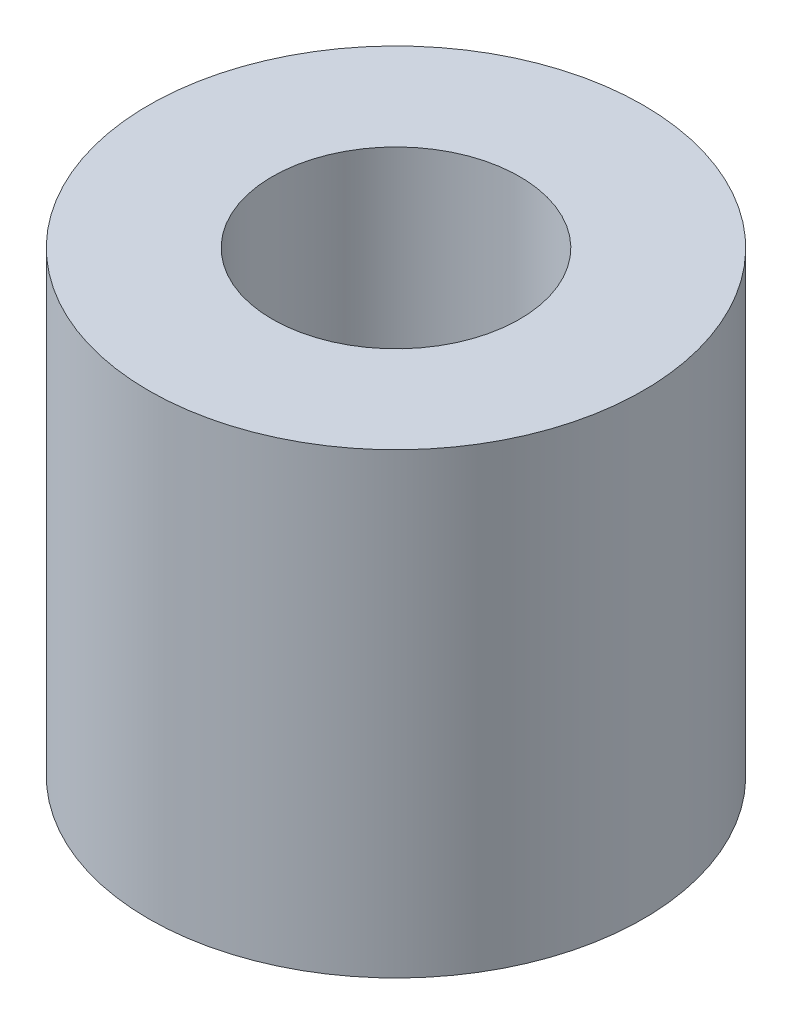
ISO-10303-21;
HEADER;
FILE_DESCRIPTION(('STEP AP214'),'2;1');
FILE_NAME('part.step','',(''),(''),'','','');
FILE_SCHEMA(('AUTOMOTIVE_DESIGN { 1 0 10303 214 1 1 1 1 }'));
ENDSEC;
DATA;
#1=APPLICATION_CONTEXT('core data for automotive mechanical design processes');
#2=APPLICATION_PROTOCOL_DEFINITION('international standard','automotive_design',2000,#1);
#3=PRODUCT_CONTEXT('',#1,'mechanical');
#4=PRODUCT('Part','Part','',(#3));
#5=PRODUCT_RELATED_PRODUCT_CATEGORY('part','',(#4));
#6=PRODUCT_DEFINITION_FORMATION('','',#4);
#7=PRODUCT_DEFINITION_CONTEXT('part definition',#1,'design');
#8=PRODUCT_DEFINITION('design','',#6,#7);
#9=PRODUCT_DEFINITION_SHAPE('','',#8);
#10=(LENGTH_UNIT() NAMED_UNIT(*) SI_UNIT(.MILLI.,.METRE.));
#11=(NAMED_UNIT(*) PLANE_ANGLE_UNIT() SI_UNIT($,.RADIAN.));
#12=(NAMED_UNIT(*) SI_UNIT($,.STERADIAN.) SOLID_ANGLE_UNIT());
#13=UNCERTAINTY_MEASURE_WITH_UNIT(LENGTH_MEASURE(1.E-05),#10,'distance_accuracy_value','');
#14=(GEOMETRIC_REPRESENTATION_CONTEXT(3) GLOBAL_UNCERTAINTY_ASSIGNED_CONTEXT((#13)) GLOBAL_UNIT_ASSIGNED_CONTEXT((#10,
#11,#12)) REPRESENTATION_CONTEXT('',''));
#15=CARTESIAN_POINT('',(0.,0.,0.));
#16=DIRECTION('',(0.,0.,1.));
#17=DIRECTION('',(1.,0.,0.));
#18=AXIS2_PLACEMENT_3D('',#15,#16,#17);
#19=CARTESIAN_POINT('',(0.,9.398,0.));
#20=DIRECTION('',(0.,1.,0.));
#21=DIRECTION('',(0.,0.,1.));
#22=AXIS2_PLACEMENT_3D('',#19,#20,#21);
#23=PLANE('',#22);
#24=CARTESIAN_POINT('',(0.,9.398,0.));
#25=DIRECTION('',(0.,1.,0.));
#26=DIRECTION('',(0.,0.,1.));
#27=AXIS2_PLACEMENT_3D('',#24,#25,#26);
#28=CIRCLE('',#27,5.08);
#29=CARTESIAN_POINT('',(0.,9.398,5.08));
#30=VERTEX_POINT('',#29);
#31=EDGE_CURVE('E10',#30,#30,#28,.T.);
#32=ORIENTED_EDGE('',*,*,#31,.T.);
#33=EDGE_LOOP('',(#32));
#34=FACE_BOUND('',#33,.T.);
#35=CARTESIAN_POINT('',(0.,9.398,0.));
#36=DIRECTION('',(0.,1.,0.));
#37=DIRECTION('',(0.,0.,1.));
#38=AXIS2_PLACEMENT_3D('',#35,#36,#37);
#39=CIRCLE('',#38,2.54);
#40=CARTESIAN_POINT('',(0.,9.398,2.54));
#41=VERTEX_POINT('',#40);
#42=EDGE_CURVE('E46',#41,#41,#39,.T.);
#43=ORIENTED_EDGE('',*,*,#42,.F.);
#44=EDGE_LOOP('',(#43));
#45=FACE_BOUND('',#44,.T.);
#46=ADVANCED_FACE('F35',(#34,#45),#23,.T.);
#47=CARTESIAN_POINT('',(0.,0.,0.));
#48=DIRECTION('',(0.,1.,0.));
#49=DIRECTION('',(0.,0.,1.));
#50=AXIS2_PLACEMENT_3D('',#47,#48,#49);
#51=PLANE('',#50);
#52=CARTESIAN_POINT('',(0.,0.,0.));
#53=DIRECTION('',(0.,1.,0.));
#54=DIRECTION('',(0.,0.,1.));
#55=AXIS2_PLACEMENT_3D('',#52,#53,#54);
#56=CIRCLE('',#55,5.08);
#57=CARTESIAN_POINT('',(0.,0.,5.08));
#58=VERTEX_POINT('',#57);
#59=EDGE_CURVE('E39',#58,#58,#56,.T.);
#60=ORIENTED_EDGE('',*,*,#59,.F.);
#61=EDGE_LOOP('',(#60));
#62=FACE_BOUND('',#61,.T.);
#63=CARTESIAN_POINT('',(0.,0.,0.));
#64=DIRECTION('',(0.,1.,0.));
#65=DIRECTION('',(0.,0.,1.));
#66=AXIS2_PLACEMENT_3D('',#63,#64,#65);
#67=CIRCLE('',#66,2.54);
#68=CARTESIAN_POINT('',(0.,0.,2.54));
#69=VERTEX_POINT('',#68);
#70=EDGE_CURVE('E48',#69,#69,#67,.T.);
#71=ORIENTED_EDGE('',*,*,#70,.T.);
#72=EDGE_LOOP('',(#71));
#73=FACE_BOUND('',#72,.T.);
#74=ADVANCED_FACE('F58',(#62,#73),#51,.F.);
#75=CARTESIAN_POINT('',(0.,9.398,0.));
#76=DIRECTION('',(0.,-1.,0.));
#77=DIRECTION('',(0.,0.,-1.));
#78=AXIS2_PLACEMENT_3D('',#75,#76,#77);
#79=CYLINDRICAL_SURFACE('',#78,5.08);
#80=ORIENTED_EDGE('',*,*,#31,.F.);
#81=EDGE_LOOP('',(#80));
#82=FACE_BOUND('',#81,.T.);
#83=ORIENTED_EDGE('',*,*,#59,.T.);
#84=EDGE_LOOP('',(#83));
#85=FACE_BOUND('',#84,.T.);
#86=ADVANCED_FACE('F37',(#82,#85),#79,.T.);
#87=CARTESIAN_POINT('',(0.,9.398,0.));
#88=DIRECTION('',(0.,-1.,0.));
#89=DIRECTION('',(0.,0.,-1.));
#90=AXIS2_PLACEMENT_3D('',#87,#88,#89);
#91=CYLINDRICAL_SURFACE('',#90,2.54);
#92=ORIENTED_EDGE('',*,*,#42,.T.);
#93=EDGE_LOOP('',(#92));
#94=FACE_BOUND('',#93,.T.);
#95=ORIENTED_EDGE('',*,*,#70,.F.);
#96=EDGE_LOOP('',(#95));
#97=FACE_BOUND('',#96,.T.);
#98=ADVANCED_FACE('F54',(#94,#97),#91,.F.);
#99=CLOSED_SHELL('',(#46,#74,#86,#98));
#100=MANIFOLD_SOLID_BREP('B2',#99);
#101=ADVANCED_BREP_SHAPE_REPRESENTATION('',(#18,#100),#14);
#102=SHAPE_DEFINITION_REPRESENTATION(#9,#101);
ENDSEC;
END-ISO-10303-21;
